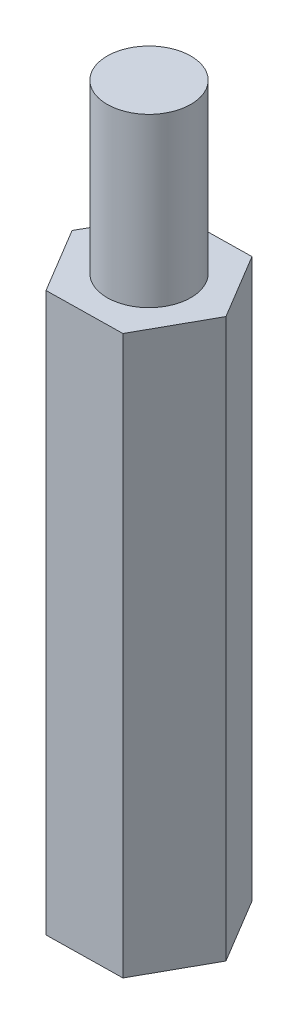
ISO-10303-21;
HEADER;
FILE_DESCRIPTION(('STEP AP214'),'2;1');
FILE_NAME('part.step','',(''),(''),'','','');
FILE_SCHEMA(('AUTOMOTIVE_DESIGN { 1 0 10303 214 1 1 1 1 }'));
ENDSEC;
DATA;
#1=APPLICATION_CONTEXT('core data for automotive mechanical design processes');
#2=APPLICATION_PROTOCOL_DEFINITION('international standard','automotive_design',2000,#1);
#3=PRODUCT_CONTEXT('',#1,'mechanical');
#4=PRODUCT('Part','Part','',(#3));
#5=PRODUCT_RELATED_PRODUCT_CATEGORY('part','',(#4));
#6=PRODUCT_DEFINITION_FORMATION('','',#4);
#7=PRODUCT_DEFINITION_CONTEXT('part definition',#1,'design');
#8=PRODUCT_DEFINITION('design','',#6,#7);
#9=PRODUCT_DEFINITION_SHAPE('','',#8);
#10=(LENGTH_UNIT() NAMED_UNIT(*) SI_UNIT(.MILLI.,.METRE.));
#11=(NAMED_UNIT(*) PLANE_ANGLE_UNIT() SI_UNIT($,.RADIAN.));
#12=(NAMED_UNIT(*) SI_UNIT($,.STERADIAN.) SOLID_ANGLE_UNIT());
#13=UNCERTAINTY_MEASURE_WITH_UNIT(LENGTH_MEASURE(1.E-05),#10,'distance_accuracy_value','');
#14=(GEOMETRIC_REPRESENTATION_CONTEXT(3) GLOBAL_UNCERTAINTY_ASSIGNED_CONTEXT((#13)) GLOBAL_UNIT_ASSIGNED_CONTEXT((#10,
#11,#12)) REPRESENTATION_CONTEXT('',''));
#15=CARTESIAN_POINT('',(0.,0.,0.));
#16=DIRECTION('',(0.,0.,1.));
#17=DIRECTION('',(1.,0.,0.));
#18=AXIS2_PLACEMENT_3D('',#15,#16,#17);
#19=CARTESIAN_POINT('',(0.,26.,0.));
#20=DIRECTION('',(0.,-1.,0.));
#21=DIRECTION('',(0.,0.,-1.));
#22=AXIS2_PLACEMENT_3D('',#19,#20,#21);
#23=CYLINDRICAL_SURFACE('',#22,1.5);
#24=CARTESIAN_POINT('',(0.,26.,0.));
#25=DIRECTION('',(0.,1.,0.));
#26=DIRECTION('',(0.,0.,1.));
#27=AXIS2_PLACEMENT_3D('',#24,#25,#26);
#28=CIRCLE('',#27,1.5);
#29=CARTESIAN_POINT('',(0.,26.,1.5));
#30=VERTEX_POINT('',#29);
#31=EDGE_CURVE('E11',#30,#30,#28,.T.);
#32=ORIENTED_EDGE('',*,*,#31,.F.);
#33=EDGE_LOOP('',(#32));
#34=FACE_BOUND('',#33,.T.);
#35=CARTESIAN_POINT('',(0.,20.,0.));
#36=DIRECTION('',(0.,1.,0.));
#37=DIRECTION('',(0.,0.,1.));
#38=AXIS2_PLACEMENT_3D('',#35,#36,#37);
#39=CIRCLE('',#38,1.5);
#40=CARTESIAN_POINT('',(0.,20.,1.5));
#41=VERTEX_POINT('',#40);
#42=EDGE_CURVE('E46',#41,#41,#39,.T.);
#43=ORIENTED_EDGE('',*,*,#42,.T.);
#44=EDGE_LOOP('',(#43));
#45=FACE_BOUND('',#44,.T.);
#46=ADVANCED_FACE('F43',(#34,#45),#23,.T.);
#47=CARTESIAN_POINT('',(0.,26.,0.));
#48=DIRECTION('',(0.,1.,0.));
#49=DIRECTION('',(0.,0.,1.));
#50=AXIS2_PLACEMENT_3D('',#47,#48,#49);
#51=PLANE('',#50);
#52=ORIENTED_EDGE('',*,*,#31,.T.);
#53=EDGE_LOOP('',(#52));
#54=FACE_BOUND('',#53,.T.);
#55=ADVANCED_FACE('F58',(#54),#51,.T.);
#56=CARTESIAN_POINT('',(0.,20.,0.));
#57=DIRECTION('',(0.,1.,0.));
#58=DIRECTION('',(0.,0.,1.));
#59=AXIS2_PLACEMENT_3D('',#56,#57,#58);
#60=PLANE('',#59);
#61=ORIENTED_EDGE('',*,*,#42,.F.);
#62=EDGE_LOOP('',(#61));
#63=FACE_BOUND('',#62,.T.);
#64=ADVANCED_FACE('F56',(#63),#60,.F.);
#65=CLOSED_SHELL('',(#46,#55,#64));
#66=MANIFOLD_SOLID_BREP('B2',#65);
#67=CARTESIAN_POINT('',(0.,20.,0.));
#68=DIRECTION('',(0.,1.,0.));
#69=DIRECTION('',(0.,0.,1.));
#70=AXIS2_PLACEMENT_3D('',#67,#68,#69);
#71=PLANE('',#70);
#72=DIRECTION('',(0.9998697085006,0.,-0.0161420575803037));
#73=VECTOR('',#72,1.);
#74=CARTESIAN_POINT('',(-1.31866252127611,20.,2.37159492500618));
#75=LINE('',#74,#73);
#76=CARTESIAN_POINT('',(-1.31866252127611,20.,2.37159492500618));
#77=VERTEX_POINT('',#76);
#78=CARTESIAN_POINT('',(1.39453019190354,20.,2.32779270494664));
#79=VERTEX_POINT('',#78);
#80=EDGE_CURVE('E180',#77,#79,#75,.T.);
#81=ORIENTED_EDGE('',*,*,#80,.T.);
#82=DIRECTION('',(0.485955422316405,0.,-0.873983596826213));
#83=VECTOR('',#82,1.);
#84=CARTESIAN_POINT('',(1.39453019190354,20.,2.32779270494664));
#85=LINE('',#84,#83);
#86=CARTESIAN_POINT('',(2.71319271317966,20.,-0.0438022200595355));
#87=VERTEX_POINT('',#86);
#88=EDGE_CURVE('E138',#79,#87,#85,.T.);
#89=ORIENTED_EDGE('',*,*,#88,.T.);
#90=DIRECTION('',(-0.513914286184194,0.,-0.857841539245909));
#91=VECTOR('',#90,1.);
#92=CARTESIAN_POINT('',(2.71319271317966,20.,-0.0438022200595355));
#93=LINE('',#92,#91);
#94=CARTESIAN_POINT('',(1.31866252127611,20.,-2.37159492500618));
#95=VERTEX_POINT('',#94);
#96=EDGE_CURVE('E151',#87,#95,#93,.T.);
#97=ORIENTED_EDGE('',*,*,#96,.T.);
#98=DIRECTION('',(-0.9998697085006,0.,0.0161420575803037));
#99=VECTOR('',#98,1.);
#100=CARTESIAN_POINT('',(1.31866252127611,20.,-2.37159492500618));
#101=LINE('',#100,#99);
#102=CARTESIAN_POINT('',(-1.39453019190354,20.,-2.32779270494664));
#103=VERTEX_POINT('',#102);
#104=EDGE_CURVE('E145',#95,#103,#101,.T.);
#105=ORIENTED_EDGE('',*,*,#104,.T.);
#106=DIRECTION('',(-0.485955422316406,0.,0.873983596826213));
#107=VECTOR('',#106,1.);
#108=CARTESIAN_POINT('',(-1.39453019190354,20.,-2.32779270494664));
#109=LINE('',#108,#107);
#110=CARTESIAN_POINT('',(-2.71319271317966,20.,0.043802220059535));
#111=VERTEX_POINT('',#110);
#112=EDGE_CURVE('E149',#103,#111,#109,.T.);
#113=ORIENTED_EDGE('',*,*,#112,.T.);
#114=DIRECTION('',(0.513914286184194,0.,0.857841539245909));
#115=VECTOR('',#114,1.);
#116=CARTESIAN_POINT('',(-2.71319271317966,20.,0.043802220059535));
#117=LINE('',#116,#115);
#118=EDGE_CURVE('E101',#111,#77,#117,.T.);
#119=ORIENTED_EDGE('',*,*,#118,.T.);
#120=EDGE_LOOP('',(#81,#89,#97,#105,#113,#119));
#121=FACE_BOUND('',#120,.T.);
#122=CARTESIAN_POINT('',(0.,20.,0.));
#123=DIRECTION('',(0.,1.,0.));
#124=DIRECTION('',(0.,0.,1.));
#125=AXIS2_PLACEMENT_3D('',#122,#123,#124);
#126=CIRCLE('',#125,1.5);
#127=CARTESIAN_POINT('',(0.,20.,1.5));
#128=VERTEX_POINT('',#127);
#129=EDGE_CURVE('E173',#128,#128,#126,.T.);
#130=ORIENTED_EDGE('',*,*,#129,.F.);
#131=EDGE_LOOP('',(#130));
#132=FACE_BOUND('',#131,.T.);
#133=ADVANCED_FACE('F84',(#121,#132),#71,.T.);
#134=CARTESIAN_POINT('',(0.,0.,0.));
#135=DIRECTION('',(0.,1.,0.));
#136=DIRECTION('',(0.,0.,1.));
#137=AXIS2_PLACEMENT_3D('',#134,#135,#136);
#138=PLANE('',#137);
#139=DIRECTION('',(0.9998697085006,0.,-0.0161420575803037));
#140=VECTOR('',#139,1.);
#141=CARTESIAN_POINT('',(-1.31866252127611,0.,2.37159492500618));
#142=LINE('',#141,#140);
#143=CARTESIAN_POINT('',(-1.31866252127611,0.,2.37159492500618));
#144=VERTEX_POINT('',#143);
#145=CARTESIAN_POINT('',(1.39453019190354,0.,2.32779270494664));
#146=VERTEX_POINT('',#145);
#147=EDGE_CURVE('E169',#144,#146,#142,.T.);
#148=ORIENTED_EDGE('',*,*,#147,.F.);
#149=DIRECTION('',(0.513914286184194,0.,0.857841539245909));
#150=VECTOR('',#149,1.);
#151=CARTESIAN_POINT('',(-2.71319271317966,0.,0.043802220059535));
#152=LINE('',#151,#150);
#153=CARTESIAN_POINT('',(-2.71319271317966,0.,0.043802220059535));
#154=VERTEX_POINT('',#153);
#155=EDGE_CURVE('E130',#154,#144,#152,.T.);
#156=ORIENTED_EDGE('',*,*,#155,.F.);
#157=DIRECTION('',(-0.485955422316406,0.,0.873983596826213));
#158=VECTOR('',#157,1.);
#159=CARTESIAN_POINT('',(-1.39453019190354,0.,-2.32779270494664));
#160=LINE('',#159,#158);
#161=CARTESIAN_POINT('',(-1.39453019190354,0.,-2.32779270494664));
#162=VERTEX_POINT('',#161);
#163=EDGE_CURVE('E124',#162,#154,#160,.T.);
#164=ORIENTED_EDGE('',*,*,#163,.F.);
#165=DIRECTION('',(-0.9998697085006,0.,0.0161420575803037));
#166=VECTOR('',#165,1.);
#167=CARTESIAN_POINT('',(1.31866252127611,0.,-2.37159492500618));
#168=LINE('',#167,#166);
#169=CARTESIAN_POINT('',(1.31866252127611,0.,-2.37159492500618));
#170=VERTEX_POINT('',#169);
#171=EDGE_CURVE('E159',#170,#162,#168,.T.);
#172=ORIENTED_EDGE('',*,*,#171,.F.);
#173=DIRECTION('',(-0.513914286184194,0.,-0.857841539245909));
#174=VECTOR('',#173,1.);
#175=CARTESIAN_POINT('',(2.71319271317966,0.,-0.0438022200595355));
#176=LINE('',#175,#174);
#177=CARTESIAN_POINT('',(2.71319271317966,0.,-0.0438022200595355));
#178=VERTEX_POINT('',#177);
#179=EDGE_CURVE('E175',#178,#170,#176,.T.);
#180=ORIENTED_EDGE('',*,*,#179,.F.);
#181=DIRECTION('',(0.485955422316405,0.,-0.873983596826213));
#182=VECTOR('',#181,1.);
#183=CARTESIAN_POINT('',(1.39453019190354,0.,2.32779270494664));
#184=LINE('',#183,#182);
#185=EDGE_CURVE('E172',#146,#178,#184,.T.);
#186=ORIENTED_EDGE('',*,*,#185,.F.);
#187=EDGE_LOOP('',(#148,#156,#164,#172,#180,#186));
#188=FACE_BOUND('',#187,.T.);
#189=CARTESIAN_POINT('',(0.,0.,0.));
#190=DIRECTION('',(0.,1.,0.));
#191=DIRECTION('',(0.,0.,1.));
#192=AXIS2_PLACEMENT_3D('',#189,#190,#191);
#193=CIRCLE('',#192,1.5);
#194=CARTESIAN_POINT('',(0.,0.,1.5));
#195=VERTEX_POINT('',#194);
#196=EDGE_CURVE('E273',#195,#195,#193,.T.);
#197=ORIENTED_EDGE('',*,*,#196,.T.);
#198=EDGE_LOOP('',(#197));
#199=FACE_BOUND('',#198,.T.);
#200=ADVANCED_FACE('F189',(#188,#199),#138,.F.);
#201=CARTESIAN_POINT('',(-1.31866252127611,20.,2.37159492500618));
#202=DIRECTION('',(-0.0161420575803037,0.,-0.9998697085006));
#203=DIRECTION('',(-0.9998697085006,0.,0.0161420575803037));
#204=AXIS2_PLACEMENT_3D('',#201,#202,#203);
#205=PLANE('',#204);
#206=ORIENTED_EDGE('',*,*,#147,.T.);
#207=DIRECTION('',(0.,-1.,0.));
#208=VECTOR('',#207,1.);
#209=CARTESIAN_POINT('',(1.39453019190354,20.,2.32779270494664));
#210=LINE('',#209,#208);
#211=EDGE_CURVE('E41',#79,#146,#210,.T.);
#212=ORIENTED_EDGE('',*,*,#211,.F.);
#213=ORIENTED_EDGE('',*,*,#80,.F.);
#214=DIRECTION('',(0.,-1.,0.));
#215=VECTOR('',#214,1.);
#216=CARTESIAN_POINT('',(-1.31866252127611,20.,2.37159492500618));
#217=LINE('',#216,#215);
#218=EDGE_CURVE('E165',#77,#144,#217,.T.);
#219=ORIENTED_EDGE('',*,*,#218,.T.);
#220=EDGE_LOOP('',(#206,#212,#213,#219));
#221=FACE_BOUND('',#220,.T.);
#222=ADVANCED_FACE('F86',(#221),#205,.F.);
#223=CARTESIAN_POINT('',(1.39453019190354,20.,2.32779270494664));
#224=DIRECTION('',(-0.873983596826213,0.,-0.485955422316406));
#225=DIRECTION('',(-0.485955422316406,0.,0.873983596826213));
#226=AXIS2_PLACEMENT_3D('',#223,#224,#225);
#227=PLANE('',#226);
#228=ORIENTED_EDGE('',*,*,#185,.T.);
#229=DIRECTION('',(0.,-1.,0.));
#230=VECTOR('',#229,1.);
#231=CARTESIAN_POINT('',(2.71319271317966,20.,-0.0438022200595355));
#232=LINE('',#231,#230);
#233=EDGE_CURVE('E93',#87,#178,#232,.T.);
#234=ORIENTED_EDGE('',*,*,#233,.F.);
#235=ORIENTED_EDGE('',*,*,#88,.F.);
#236=ORIENTED_EDGE('',*,*,#211,.T.);
#237=EDGE_LOOP('',(#228,#234,#235,#236));
#238=FACE_BOUND('',#237,.T.);
#239=ADVANCED_FACE('F214',(#238),#227,.F.);
#240=CARTESIAN_POINT('',(2.71319271317966,20.,-0.0438022200595355));
#241=DIRECTION('',(-0.857841539245909,0.,0.513914286184194));
#242=DIRECTION('',(0.513914286184194,0.,0.857841539245909));
#243=AXIS2_PLACEMENT_3D('',#240,#241,#242);
#244=PLANE('',#243);
#245=ORIENTED_EDGE('',*,*,#179,.T.);
#246=DIRECTION('',(0.,-1.,0.));
#247=VECTOR('',#246,1.);
#248=CARTESIAN_POINT('',(1.31866252127611,20.,-2.37159492500618));
#249=LINE('',#248,#247);
#250=EDGE_CURVE('E160',#95,#170,#249,.T.);
#251=ORIENTED_EDGE('',*,*,#250,.F.);
#252=ORIENTED_EDGE('',*,*,#96,.F.);
#253=ORIENTED_EDGE('',*,*,#233,.T.);
#254=EDGE_LOOP('',(#245,#251,#252,#253));
#255=FACE_BOUND('',#254,.T.);
#256=ADVANCED_FACE('F186',(#255),#244,.F.);
#257=CARTESIAN_POINT('',(1.31866252127611,20.,-2.37159492500618));
#258=DIRECTION('',(0.0161420575803037,0.,0.9998697085006));
#259=DIRECTION('',(0.9998697085006,0.,-0.0161420575803038));
#260=AXIS2_PLACEMENT_3D('',#257,#258,#259);
#261=PLANE('',#260);
#262=ORIENTED_EDGE('',*,*,#171,.T.);
#263=DIRECTION('',(0.,-1.,0.));
#264=VECTOR('',#263,1.);
#265=CARTESIAN_POINT('',(-1.39453019190354,20.,-2.32779270494664));
#266=LINE('',#265,#264);
#267=EDGE_CURVE('E156',#103,#162,#266,.T.);
#268=ORIENTED_EDGE('',*,*,#267,.F.);
#269=ORIENTED_EDGE('',*,*,#104,.F.);
#270=ORIENTED_EDGE('',*,*,#250,.T.);
#271=EDGE_LOOP('',(#262,#268,#269,#270));
#272=FACE_BOUND('',#271,.T.);
#273=ADVANCED_FACE('F157',(#272),#261,.F.);
#274=CARTESIAN_POINT('',(-1.39453019190354,20.,-2.32779270494664));
#275=DIRECTION('',(0.873983596826213,0.,0.485955422316406));
#276=DIRECTION('',(0.485955422316406,0.,-0.873983596826213));
#277=AXIS2_PLACEMENT_3D('',#274,#275,#276);
#278=PLANE('',#277);
#279=ORIENTED_EDGE('',*,*,#163,.T.);
#280=DIRECTION('',(0.,-1.,0.));
#281=VECTOR('',#280,1.);
#282=CARTESIAN_POINT('',(-2.71319271317966,20.,0.043802220059535));
#283=LINE('',#282,#281);
#284=EDGE_CURVE('E161',#111,#154,#283,.T.);
#285=ORIENTED_EDGE('',*,*,#284,.F.);
#286=ORIENTED_EDGE('',*,*,#112,.F.);
#287=ORIENTED_EDGE('',*,*,#267,.T.);
#288=EDGE_LOOP('',(#279,#285,#286,#287));
#289=FACE_BOUND('',#288,.T.);
#290=ADVANCED_FACE('F163',(#289),#278,.F.);
#291=CARTESIAN_POINT('',(-2.71319271317966,20.,0.043802220059535));
#292=DIRECTION('',(0.857841539245909,0.,-0.513914286184194));
#293=DIRECTION('',(-0.513914286184194,0.,-0.857841539245909));
#294=AXIS2_PLACEMENT_3D('',#291,#292,#293);
#295=PLANE('',#294);
#296=ORIENTED_EDGE('',*,*,#155,.T.);
#297=ORIENTED_EDGE('',*,*,#218,.F.);
#298=ORIENTED_EDGE('',*,*,#118,.F.);
#299=ORIENTED_EDGE('',*,*,#284,.T.);
#300=EDGE_LOOP('',(#296,#297,#298,#299));
#301=FACE_BOUND('',#300,.T.);
#302=ADVANCED_FACE('F194',(#301),#295,.F.);
#303=CARTESIAN_POINT('',(0.,20.,0.));
#304=DIRECTION('',(0.,-1.,0.));
#305=DIRECTION('',(0.,0.,-1.));
#306=AXIS2_PLACEMENT_3D('',#303,#304,#305);
#307=CYLINDRICAL_SURFACE('',#306,1.5);
#308=ORIENTED_EDGE('',*,*,#129,.T.);
#309=EDGE_LOOP('',(#308));
#310=FACE_BOUND('',#309,.T.);
#311=ORIENTED_EDGE('',*,*,#196,.F.);
#312=EDGE_LOOP('',(#311));
#313=FACE_BOUND('',#312,.T.);
#314=ADVANCED_FACE('F196',(#310,#313),#307,.F.);
#315=CLOSED_SHELL('',(#133,#200,#222,#239,#256,#273,#290,#302,#314));
#316=MANIFOLD_SOLID_BREP('B6',#315);
#317=ADVANCED_BREP_SHAPE_REPRESENTATION('',(#18,#66,#316),#14);
#318=SHAPE_DEFINITION_REPRESENTATION(#9,#317);
ENDSEC;
END-ISO-10303-21;
